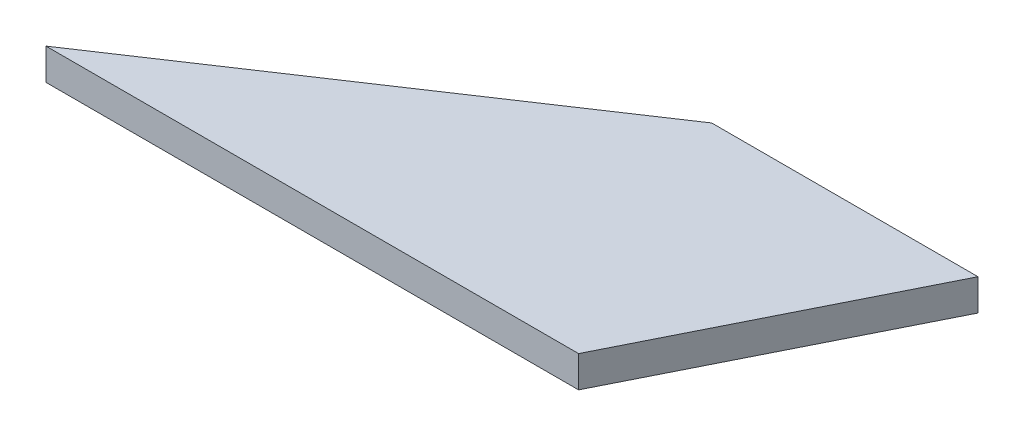
ISO-10303-21;
HEADER;
FILE_DESCRIPTION(('STEP AP214'),'2;1');
FILE_NAME('part.step','',(''),(''),'','','');
FILE_SCHEMA(('AUTOMOTIVE_DESIGN { 1 0 10303 214 1 1 1 1 }'));
ENDSEC;
DATA;
#1=APPLICATION_CONTEXT('core data for automotive mechanical design processes');
#2=APPLICATION_PROTOCOL_DEFINITION('international standard','automotive_design',2000,#1);
#3=PRODUCT_CONTEXT('',#1,'mechanical');
#4=PRODUCT('Part','Part','',(#3));
#5=PRODUCT_RELATED_PRODUCT_CATEGORY('part','',(#4));
#6=PRODUCT_DEFINITION_FORMATION('','',#4);
#7=PRODUCT_DEFINITION_CONTEXT('part definition',#1,'design');
#8=PRODUCT_DEFINITION('design','',#6,#7);
#9=PRODUCT_DEFINITION_SHAPE('','',#8);
#10=(LENGTH_UNIT() NAMED_UNIT(*) SI_UNIT(.MILLI.,.METRE.));
#11=(NAMED_UNIT(*) PLANE_ANGLE_UNIT() SI_UNIT($,.RADIAN.));
#12=(NAMED_UNIT(*) SI_UNIT($,.STERADIAN.) SOLID_ANGLE_UNIT());
#13=UNCERTAINTY_MEASURE_WITH_UNIT(LENGTH_MEASURE(1.E-05),#10,'distance_accuracy_value','');
#14=(GEOMETRIC_REPRESENTATION_CONTEXT(3) GLOBAL_UNCERTAINTY_ASSIGNED_CONTEXT((#13)) GLOBAL_UNIT_ASSIGNED_CONTEXT((#10,
#11,#12)) REPRESENTATION_CONTEXT('',''));
#15=CARTESIAN_POINT('',(0.,0.,0.));
#16=DIRECTION('',(0.,0.,1.));
#17=DIRECTION('',(1.,0.,0.));
#18=AXIS2_PLACEMENT_3D('',#15,#16,#17);
#19=CARTESIAN_POINT('',(38.1,3.,-25.4));
#20=DIRECTION('',(0.,0.,-1.));
#21=DIRECTION('',(-1.,0.,0.));
#22=AXIS2_PLACEMENT_3D('',#19,#20,#21);
#23=PLANE('',#22);
#24=DIRECTION('',(1.,0.,0.));
#25=VECTOR('',#24,1.);
#26=CARTESIAN_POINT('',(38.1,0.,-25.4));
#27=LINE('',#26,#25);
#28=CARTESIAN_POINT('',(38.1,0.,-25.4));
#29=VERTEX_POINT('',#28);
#30=CARTESIAN_POINT('',(63.5,0.,-25.4));
#31=VERTEX_POINT('',#30);
#32=EDGE_CURVE('E115',#29,#31,#27,.T.);
#33=ORIENTED_EDGE('',*,*,#32,.F.);
#34=DIRECTION('',(0.,-1.,0.));
#35=VECTOR('',#34,1.);
#36=CARTESIAN_POINT('',(38.1,3.,-25.4));
#37=LINE('',#36,#35);
#38=CARTESIAN_POINT('',(38.1,3.,-25.4));
#39=VERTEX_POINT('',#38);
#40=EDGE_CURVE('E11',#39,#29,#37,.T.);
#41=ORIENTED_EDGE('',*,*,#40,.F.);
#42=DIRECTION('',(1.,0.,0.));
#43=VECTOR('',#42,1.);
#44=CARTESIAN_POINT('',(38.1,3.,-25.4));
#45=LINE('',#44,#43);
#46=CARTESIAN_POINT('',(63.5,3.,-25.4));
#47=VERTEX_POINT('',#46);
#48=EDGE_CURVE('E107',#39,#47,#45,.T.);
#49=ORIENTED_EDGE('',*,*,#48,.T.);
#50=DIRECTION('',(0.,-1.,0.));
#51=VECTOR('',#50,1.);
#52=CARTESIAN_POINT('',(63.5,3.,-25.4));
#53=LINE('',#52,#51);
#54=EDGE_CURVE('E48',#47,#31,#53,.T.);
#55=ORIENTED_EDGE('',*,*,#54,.T.);
#56=EDGE_LOOP('',(#33,#41,#49,#55));
#57=FACE_BOUND('',#56,.T.);
#58=ADVANCED_FACE('F45',(#57),#23,.T.);
#59=CARTESIAN_POINT('',(0.,3.,0.));
#60=DIRECTION('',(-0.554700196225229,0.,-0.832050294337843));
#61=DIRECTION('',(-0.832050294337844,0.,0.554700196225229));
#62=AXIS2_PLACEMENT_3D('',#59,#60,#61);
#63=PLANE('',#62);
#64=DIRECTION('',(0.832050294337844,0.,-0.554700196225229));
#65=VECTOR('',#64,1.);
#66=CARTESIAN_POINT('',(0.,0.,0.));
#67=LINE('',#66,#65);
#68=CARTESIAN_POINT('',(0.,0.,0.));
#69=VERTEX_POINT('',#68);
#70=EDGE_CURVE('E110',#69,#29,#67,.T.);
#71=ORIENTED_EDGE('',*,*,#70,.F.);
#72=DIRECTION('',(0.,-1.,0.));
#73=VECTOR('',#72,1.);
#74=CARTESIAN_POINT('',(0.,3.,0.));
#75=LINE('',#74,#73);
#76=CARTESIAN_POINT('',(0.,3.,0.));
#77=VERTEX_POINT('',#76);
#78=EDGE_CURVE('E55',#77,#69,#75,.T.);
#79=ORIENTED_EDGE('',*,*,#78,.F.);
#80=DIRECTION('',(0.832050294337844,0.,-0.554700196225229));
#81=VECTOR('',#80,1.);
#82=CARTESIAN_POINT('',(0.,3.,0.));
#83=LINE('',#82,#81);
#84=EDGE_CURVE('E97',#77,#39,#83,.T.);
#85=ORIENTED_EDGE('',*,*,#84,.T.);
#86=ORIENTED_EDGE('',*,*,#40,.T.);
#87=EDGE_LOOP('',(#71,#79,#85,#86));
#88=FACE_BOUND('',#87,.T.);
#89=ADVANCED_FACE('F131',(#88),#63,.T.);
#90=CARTESIAN_POINT('',(0.,3.,0.));
#91=DIRECTION('',(0.,0.,-1.));
#92=DIRECTION('',(-1.,0.,0.));
#93=AXIS2_PLACEMENT_3D('',#90,#91,#92);
#94=PLANE('',#93);
#95=DIRECTION('',(1.,0.,0.));
#96=VECTOR('',#95,1.);
#97=CARTESIAN_POINT('',(0.,0.,0.));
#98=LINE('',#97,#96);
#99=CARTESIAN_POINT('',(50.8,0.,0.));
#100=VERTEX_POINT('',#99);
#101=EDGE_CURVE('E102',#69,#100,#98,.T.);
#102=ORIENTED_EDGE('',*,*,#101,.T.);
#103=DIRECTION('',(0.,-1.,0.));
#104=VECTOR('',#103,1.);
#105=CARTESIAN_POINT('',(50.8,3.,0.));
#106=LINE('',#105,#104);
#107=CARTESIAN_POINT('',(50.8,3.,0.));
#108=VERTEX_POINT('',#107);
#109=EDGE_CURVE('E100',#108,#100,#106,.T.);
#110=ORIENTED_EDGE('',*,*,#109,.F.);
#111=DIRECTION('',(1.,0.,0.));
#112=VECTOR('',#111,1.);
#113=CARTESIAN_POINT('',(0.,3.,0.));
#114=LINE('',#113,#112);
#115=EDGE_CURVE('E93',#77,#108,#114,.T.);
#116=ORIENTED_EDGE('',*,*,#115,.F.);
#117=ORIENTED_EDGE('',*,*,#78,.T.);
#118=EDGE_LOOP('',(#102,#110,#116,#117));
#119=FACE_BOUND('',#118,.T.);
#120=ADVANCED_FACE('F101',(#119),#94,.F.);
#121=CARTESIAN_POINT('',(63.5,3.,-25.4));
#122=DIRECTION('',(0.894427190999916,0.,0.447213595499958));
#123=DIRECTION('',(0.447213595499958,0.,-0.894427190999916));
#124=AXIS2_PLACEMENT_3D('',#121,#122,#123);
#125=PLANE('',#124);
#126=DIRECTION('',(-0.447213595499958,0.,0.894427190999916));
#127=VECTOR('',#126,1.);
#128=CARTESIAN_POINT('',(63.5,0.,-25.4));
#129=LINE('',#128,#127);
#130=EDGE_CURVE('E119',#31,#100,#129,.T.);
#131=ORIENTED_EDGE('',*,*,#130,.F.);
#132=ORIENTED_EDGE('',*,*,#54,.F.);
#133=DIRECTION('',(-0.447213595499958,0.,0.894427190999916));
#134=VECTOR('',#133,1.);
#135=CARTESIAN_POINT('',(63.5,3.,-25.4));
#136=LINE('',#135,#134);
#137=EDGE_CURVE('E96',#47,#108,#136,.T.);
#138=ORIENTED_EDGE('',*,*,#137,.T.);
#139=ORIENTED_EDGE('',*,*,#109,.T.);
#140=EDGE_LOOP('',(#131,#132,#138,#139));
#141=FACE_BOUND('',#140,.T.);
#142=ADVANCED_FACE('F105',(#141),#125,.T.);
#143=CARTESIAN_POINT('',(0.,3.,0.));
#144=DIRECTION('',(0.,-1.,0.));
#145=DIRECTION('',(0.,0.,-1.));
#146=AXIS2_PLACEMENT_3D('',#143,#144,#145);
#147=PLANE('',#146);
#148=ORIENTED_EDGE('',*,*,#48,.F.);
#149=ORIENTED_EDGE('',*,*,#84,.F.);
#150=ORIENTED_EDGE('',*,*,#115,.T.);
#151=ORIENTED_EDGE('',*,*,#137,.F.);
#152=EDGE_LOOP('',(#148,#149,#150,#151));
#153=FACE_BOUND('',#152,.T.);
#154=ADVANCED_FACE('F95',(#153),#147,.F.);
#155=CARTESIAN_POINT('',(0.,0.,0.));
#156=DIRECTION('',(0.,-1.,0.));
#157=DIRECTION('',(0.,0.,-1.));
#158=AXIS2_PLACEMENT_3D('',#155,#156,#157);
#159=PLANE('',#158);
#160=ORIENTED_EDGE('',*,*,#32,.T.);
#161=ORIENTED_EDGE('',*,*,#130,.T.);
#162=ORIENTED_EDGE('',*,*,#101,.F.);
#163=ORIENTED_EDGE('',*,*,#70,.T.);
#164=EDGE_LOOP('',(#160,#161,#162,#163));
#165=FACE_BOUND('',#164,.T.);
#166=ADVANCED_FACE('F130',(#165),#159,.T.);
#167=CLOSED_SHELL('',(#58,#89,#120,#142,#154,#166));
#168=MANIFOLD_SOLID_BREP('B2',#167);
#169=ADVANCED_BREP_SHAPE_REPRESENTATION('',(#18,#168),#14);
#170=SHAPE_DEFINITION_REPRESENTATION(#9,#169);
ENDSEC;
END-ISO-10303-21;
